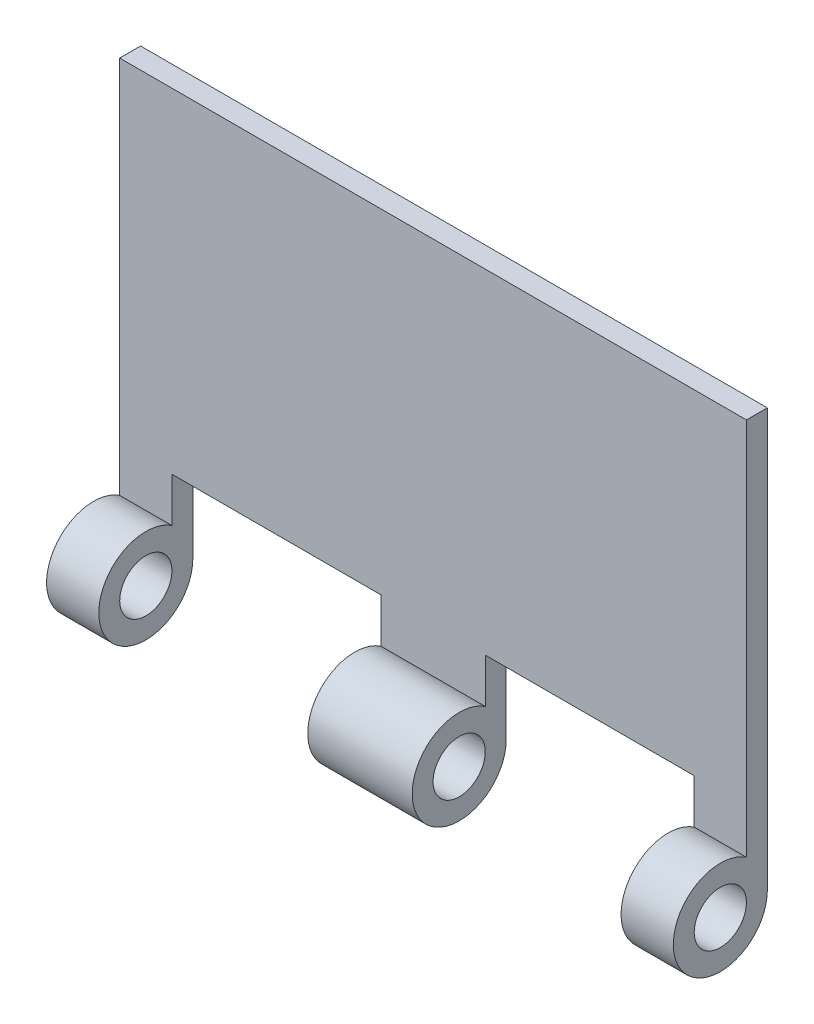
ISO-10303-21;
HEADER;
FILE_DESCRIPTION(('STEP AP214'),'2;1');
FILE_NAME('part.step','',(''),(''),'','','');
FILE_SCHEMA(('AUTOMOTIVE_DESIGN { 1 0 10303 214 1 1 1 1 }'));
ENDSEC;
DATA;
#1=APPLICATION_CONTEXT('core data for automotive mechanical design processes');
#2=APPLICATION_PROTOCOL_DEFINITION('international standard','automotive_design',2000,#1);
#3=PRODUCT_CONTEXT('',#1,'mechanical');
#4=PRODUCT('Part','Part','',(#3));
#5=PRODUCT_RELATED_PRODUCT_CATEGORY('part','',(#4));
#6=PRODUCT_DEFINITION_FORMATION('','',#4);
#7=PRODUCT_DEFINITION_CONTEXT('part definition',#1,'design');
#8=PRODUCT_DEFINITION('design','',#6,#7);
#9=PRODUCT_DEFINITION_SHAPE('','',#8);
#10=(LENGTH_UNIT() NAMED_UNIT(*) SI_UNIT(.MILLI.,.METRE.));
#11=(NAMED_UNIT(*) PLANE_ANGLE_UNIT() SI_UNIT($,.RADIAN.));
#12=(NAMED_UNIT(*) SI_UNIT($,.STERADIAN.) SOLID_ANGLE_UNIT());
#13=UNCERTAINTY_MEASURE_WITH_UNIT(LENGTH_MEASURE(1.E-05),#10,'distance_accuracy_value','');
#14=(GEOMETRIC_REPRESENTATION_CONTEXT(3) GLOBAL_UNCERTAINTY_ASSIGNED_CONTEXT((#13)) GLOBAL_UNIT_ASSIGNED_CONTEXT((#10,
#11,#12)) REPRESENTATION_CONTEXT('',''));
#15=CARTESIAN_POINT('',(0.,0.,0.));
#16=DIRECTION('',(0.,0.,1.));
#17=DIRECTION('',(1.,0.,0.));
#18=AXIS2_PLACEMENT_3D('',#15,#16,#17);
#19=CARTESIAN_POINT('',(16.1644610179245,0.,5.715));
#20=DIRECTION('',(-1.,0.,0.));
#21=DIRECTION('',(0.,0.,1.));
#22=AXIS2_PLACEMENT_3D('',#19,#20,#21);
#23=CYLINDRICAL_SURFACE('',#22,5.715);
#24=CARTESIAN_POINT('',(-6.35,0.,5.715));
#25=DIRECTION('',(1.,0.,0.));
#26=DIRECTION('',(0.,1.,0.));
#27=AXIS2_PLACEMENT_3D('',#24,#25,#26);
#28=CIRCLE('',#27,5.715);
#29=CARTESIAN_POINT('',(-6.35,0.,0.));
#30=VERTEX_POINT('',#29);
#31=CARTESIAN_POINT('',(-6.35,4.7519048812029,2.54));
#32=VERTEX_POINT('',#31);
#33=EDGE_CURVE('E200',#30,#32,#28,.F.);
#34=ORIENTED_EDGE('',*,*,#33,.F.);
#35=DIRECTION('',(1.,0.,0.));
#36=VECTOR('',#35,1.);
#37=CARTESIAN_POINT('',(0.,0.,0.));
#38=LINE('',#37,#36);
#39=CARTESIAN_POINT('',(0.,0.,0.));
#40=VERTEX_POINT('',#39);
#41=EDGE_CURVE('E254',#30,#40,#38,.T.);
#42=ORIENTED_EDGE('',*,*,#41,.T.);
#43=CARTESIAN_POINT('',(0.,0.,5.715));
#44=DIRECTION('',(-1.,0.,0.));
#45=DIRECTION('',(0.,0.,1.));
#46=AXIS2_PLACEMENT_3D('',#43,#44,#45);
#47=CIRCLE('',#46,5.715);
#48=CARTESIAN_POINT('',(0.,4.7519048812029,2.54));
#49=VERTEX_POINT('',#48);
#50=EDGE_CURVE('E212',#49,#40,#47,.F.);
#51=ORIENTED_EDGE('',*,*,#50,.F.);
#52=DIRECTION('',(-1.,0.,0.));
#53=VECTOR('',#52,1.);
#54=CARTESIAN_POINT('',(16.1644610179245,4.7519048812029,2.54));
#55=LINE('',#54,#53);
#56=EDGE_CURVE('E228',#49,#32,#55,.T.);
#57=ORIENTED_EDGE('',*,*,#56,.T.);
#58=EDGE_LOOP('',(#34,#42,#51,#57));
#59=FACE_BOUND('',#58,.T.);
#60=ADVANCED_FACE('F39',(#59),#23,.T.);
#61=CARTESIAN_POINT('',(-44.45,0.,0.));
#62=VERTEX_POINT('',#61);
#63=CARTESIAN_POINT('',(-31.75,0.,0.));
#64=VERTEX_POINT('',#63);
#65=EDGE_CURVE('E258',#62,#64,#38,.T.);
#66=ORIENTED_EDGE('',*,*,#65,.T.);
#67=CARTESIAN_POINT('',(-31.75,0.,5.715));
#68=DIRECTION('',(-1.,0.,0.));
#69=DIRECTION('',(0.,0.,1.));
#70=AXIS2_PLACEMENT_3D('',#67,#68,#69);
#71=CIRCLE('',#70,5.715);
#72=CARTESIAN_POINT('',(-31.75,4.7519048812029,2.54));
#73=VERTEX_POINT('',#72);
#74=EDGE_CURVE('E148',#73,#64,#71,.F.);
#75=ORIENTED_EDGE('',*,*,#74,.F.);
#76=CARTESIAN_POINT('',(-44.45,4.7519048812029,2.54));
#77=VERTEX_POINT('',#76);
#78=EDGE_CURVE('E233',#73,#77,#55,.T.);
#79=ORIENTED_EDGE('',*,*,#78,.T.);
#80=CARTESIAN_POINT('',(-44.45,0.,5.715));
#81=DIRECTION('',(1.,0.,0.));
#82=DIRECTION('',(0.,0.,-1.));
#83=AXIS2_PLACEMENT_3D('',#80,#81,#82);
#84=CIRCLE('',#83,5.715);
#85=EDGE_CURVE('E189',#62,#77,#84,.F.);
#86=ORIENTED_EDGE('',*,*,#85,.F.);
#87=EDGE_LOOP('',(#66,#75,#79,#86));
#88=FACE_BOUND('',#87,.T.);
#89=ADVANCED_FACE('F284',(#88),#23,.T.);
#90=CARTESIAN_POINT('',(16.1644610179245,0.,5.715));
#91=DIRECTION('',(-1.,0.,0.));
#92=DIRECTION('',(0.,0.,1.));
#93=AXIS2_PLACEMENT_3D('',#90,#91,#92);
#94=CYLINDRICAL_SURFACE('',#93,3.175);
#95=CARTESIAN_POINT('',(-6.35,0.,5.715));
#96=DIRECTION('',(1.,0.,0.));
#97=DIRECTION('',(0.,1.,0.));
#98=AXIS2_PLACEMENT_3D('',#95,#96,#97);
#99=CIRCLE('',#98,3.175);
#100=CARTESIAN_POINT('',(-6.35,0.,8.89));
#101=VERTEX_POINT('',#100);
#102=EDGE_CURVE('E43',#101,#101,#99,.F.);
#103=CARTESIAN_POINT('',(0.,0.,5.715));
#104=DIRECTION('',(-1.,0.,0.));
#105=DIRECTION('',(0.,0.,1.));
#106=AXIS2_PLACEMENT_3D('',#103,#104,#105);
#107=CIRCLE('',#106,3.175);
#108=CARTESIAN_POINT('',(0.,0.,8.89));
#109=VERTEX_POINT('',#108);
#110=EDGE_CURVE('E217',#109,#109,#107,.F.);
#111=CARTESIAN_POINT('',(-6.35,0.,8.89));
#112=CARTESIAN_POINT('',(-6.28385416666667,0.,8.89));
#113=CARTESIAN_POINT('',(-6.21770833333334,0.,8.89));
#114=CARTESIAN_POINT('',(-6.08541666666667,0.,8.89));
#115=CARTESIAN_POINT('',(-6.01927083333334,0.,8.89));
#116=CARTESIAN_POINT('',(-5.88697916666667,0.,8.89));
#117=CARTESIAN_POINT('',(-5.82083333333334,0.,8.89));
#118=CARTESIAN_POINT('',(-5.68854166666667,0.,8.89));
#119=CARTESIAN_POINT('',(-5.62239583333334,0.,8.89));
#120=CARTESIAN_POINT('',(-5.49010416666667,0.,8.89));
#121=CARTESIAN_POINT('',(-5.42395833333334,0.,8.89));
#122=CARTESIAN_POINT('',(-5.29166666666667,0.,8.89));
#123=CARTESIAN_POINT('',(-5.22552083333334,0.,8.89));
#124=CARTESIAN_POINT('',(-5.09322916666667,0.,8.89));
#125=CARTESIAN_POINT('',(-5.02708333333334,0.,8.89));
#126=CARTESIAN_POINT('',(-4.89479166666667,0.,8.89));
#127=CARTESIAN_POINT('',(-4.82864583333334,0.,8.89));
#128=CARTESIAN_POINT('',(-4.69635416666667,0.,8.89));
#129=CARTESIAN_POINT('',(-4.63020833333334,0.,8.89));
#130=CARTESIAN_POINT('',(-4.49791666666667,0.,8.89));
#131=CARTESIAN_POINT('',(-4.43177083333333,0.,8.89));
#132=CARTESIAN_POINT('',(-4.29947916666667,0.,8.89));
#133=CARTESIAN_POINT('',(-4.23333333333334,0.,8.89));
#134=CARTESIAN_POINT('',(-4.10104166666667,0.,8.89));
#135=CARTESIAN_POINT('',(-4.03489583333334,0.,8.89));
#136=CARTESIAN_POINT('',(-3.90260416666667,0.,8.89));
#137=CARTESIAN_POINT('',(-3.83645833333334,0.,8.89));
#138=CARTESIAN_POINT('',(-3.70416666666667,0.,8.89));
#139=CARTESIAN_POINT('',(-3.63802083333334,0.,8.89));
#140=CARTESIAN_POINT('',(-3.50572916666667,0.,8.89));
#141=CARTESIAN_POINT('',(-3.43958333333333,0.,8.89));
#142=CARTESIAN_POINT('',(-3.30729166666667,0.,8.89));
#143=CARTESIAN_POINT('',(-3.24114583333333,0.,8.89));
#144=CARTESIAN_POINT('',(-3.10885416666667,0.,8.89));
#145=CARTESIAN_POINT('',(-3.04270833333333,0.,8.89));
#146=CARTESIAN_POINT('',(-2.91041666666667,0.,8.89));
#147=CARTESIAN_POINT('',(-2.84427083333333,0.,8.89));
#148=CARTESIAN_POINT('',(-2.71197916666667,0.,8.89));
#149=CARTESIAN_POINT('',(-2.64583333333333,0.,8.89));
#150=CARTESIAN_POINT('',(-2.51354166666667,0.,8.89));
#151=CARTESIAN_POINT('',(-2.44739583333333,0.,8.89));
#152=CARTESIAN_POINT('',(-2.31510416666667,0.,8.89));
#153=CARTESIAN_POINT('',(-2.24895833333333,0.,8.89));
#154=CARTESIAN_POINT('',(-2.11666666666667,0.,8.89));
#155=CARTESIAN_POINT('',(-2.05052083333333,0.,8.89));
#156=CARTESIAN_POINT('',(-1.91822916666667,0.,8.89));
#157=CARTESIAN_POINT('',(-1.85208333333333,0.,8.89));
#158=CARTESIAN_POINT('',(-1.71979166666666,0.,8.89));
#159=CARTESIAN_POINT('',(-1.65364583333333,0.,8.89));
#160=CARTESIAN_POINT('',(-1.52135416666667,0.,8.89));
#161=CARTESIAN_POINT('',(-1.45520833333333,0.,8.89));
#162=CARTESIAN_POINT('',(-1.32291666666667,0.,8.89));
#163=CARTESIAN_POINT('',(-1.25677083333333,0.,8.89));
#164=CARTESIAN_POINT('',(-1.12447916666666,0.,8.89));
#165=CARTESIAN_POINT('',(-1.05833333333333,0.,8.89));
#166=CARTESIAN_POINT('',(-0.926041666666665,0.,8.89));
#167=CARTESIAN_POINT('',(-0.859895833333332,0.,8.89));
#168=CARTESIAN_POINT('',(-0.727604166666665,0.,8.89));
#169=CARTESIAN_POINT('',(-0.661458333333331,0.,8.89));
#170=CARTESIAN_POINT('',(-0.529166666666664,0.,8.89));
#171=CARTESIAN_POINT('',(-0.463020833333331,0.,8.89));
#172=CARTESIAN_POINT('',(-0.330729166666665,0.,8.89));
#173=CARTESIAN_POINT('',(-0.264583333333332,0.,8.89));
#174=CARTESIAN_POINT('',(-0.132291666666665,0.,8.89));
#175=CARTESIAN_POINT('',(-0.0661458333333306,0.,8.89));
#176=CARTESIAN_POINT('',(0.,0.,8.89));
#177=B_SPLINE_CURVE_WITH_KNOTS('',3,(#111,#112,#113,#114,#115,#116,#117,#118,#119,#120,#121,
#122,#123,#124,#125,#126,#127,#128,#129,#130,#131,#132,#133,#134,#135,#136,#137,#138,#139,#140,
#141,#142,#143,#144,#145,#146,#147,#148,#149,#150,#151,#152,#153,#154,#155,#156,#157,#158,#159,
#160,#161,#162,#163,#164,#165,#166,#167,#168,#169,#170,#171,#172,#173,#174,#175,#176),
.UNSPECIFIED.,.F.,.F.,(4,2,2,2,2,2,2,2,2,2,2,2,2,2,2,2,2,2,2,2,2,2,2,2,2,2,2,2,2,2,2,2,4),(0.,
0.198437499999999,0.396875000000001,0.5953125,0.793750000000003,0.992187500000002,1.190625,
1.3890625,1.5875,1.7859375,1.984375,2.1828125,2.38125,2.5796875,2.778125,2.97656250000001,3.175,
3.3734375,3.57187500000001,3.7703125,3.96875000000001,4.16718750000001,4.365625,
4.56406250000001,4.76250000000001,4.96093750000001,5.15937500000001,5.35781250000001,
5.55625000000001,5.75468750000001,5.95312500000001,6.15156250000001,6.35000000000001),.UNSPECIFIED.);
#178=EDGE_CURVE('BSEAM291',#101,#109,#177,.T.);
#179=ORIENTED_EDGE('',*,*,#102,.T.);
#180=ORIENTED_EDGE('',*,*,#110,.T.);
#181=ORIENTED_EDGE('',*,*,#178,.T.);
#182=ORIENTED_EDGE('',*,*,#178,.F.);
#183=EDGE_LOOP('',(#179,#181,#180,#182));
#184=FACE_BOUND('',#183,.T.);
#185=ADVANCED_FACE('F291',(#184),#94,.F.);
#186=CARTESIAN_POINT('',(0.,0.,2.54));
#187=DIRECTION('',(-1.,0.,0.));
#188=DIRECTION('',(0.,0.,1.));
#189=AXIS2_PLACEMENT_3D('',#186,#187,#188);
#190=PLANE('',#189);
#191=DIRECTION('',(0.,1.,0.));
#192=VECTOR('',#191,1.);
#193=CARTESIAN_POINT('',(0.,0.,2.54));
#194=LINE('',#193,#192);
#195=CARTESIAN_POINT('',(0.,50.8,2.54));
#196=VERTEX_POINT('',#195);
#197=EDGE_CURVE('E234',#49,#196,#194,.T.);
#198=ORIENTED_EDGE('',*,*,#197,.F.);
#199=ORIENTED_EDGE('',*,*,#50,.T.);
#200=DIRECTION('',(0.,1.,0.));
#201=VECTOR('',#200,1.);
#202=CARTESIAN_POINT('',(0.,0.,0.));
#203=LINE('',#202,#201);
#204=CARTESIAN_POINT('',(0.,50.8,0.));
#205=VERTEX_POINT('',#204);
#206=EDGE_CURVE('E232',#40,#205,#203,.T.);
#207=ORIENTED_EDGE('',*,*,#206,.T.);
#208=DIRECTION('',(0.,0.,-1.));
#209=VECTOR('',#208,1.);
#210=CARTESIAN_POINT('',(0.,50.8,2.54));
#211=LINE('',#210,#209);
#212=EDGE_CURVE('E11',#196,#205,#211,.T.);
#213=ORIENTED_EDGE('',*,*,#212,.F.);
#214=EDGE_LOOP('',(#198,#199,#207,#213));
#215=FACE_BOUND('',#214,.T.);
#216=ORIENTED_EDGE('',*,*,#110,.F.);
#217=EDGE_LOOP('',(#216));
#218=FACE_BOUND('',#217,.T.);
#219=ADVANCED_FACE('F41',(#215,#218),#190,.F.);
#220=CARTESIAN_POINT('',(0.,50.8,2.54));
#221=DIRECTION('',(0.,-1.,0.));
#222=DIRECTION('',(1.,0.,0.));
#223=AXIS2_PLACEMENT_3D('',#220,#221,#222);
#224=PLANE('',#223);
#225=DIRECTION('',(-1.,0.,0.));
#226=VECTOR('',#225,1.);
#227=CARTESIAN_POINT('',(0.,50.8,0.));
#228=LINE('',#227,#226);
#229=CARTESIAN_POINT('',(-76.2,50.8,0.));
#230=VERTEX_POINT('',#229);
#231=EDGE_CURVE('E248',#205,#230,#228,.T.);
#232=ORIENTED_EDGE('',*,*,#231,.T.);
#233=DIRECTION('',(0.,0.,-1.));
#234=VECTOR('',#233,1.);
#235=CARTESIAN_POINT('',(-76.2,50.8,2.54));
#236=LINE('',#235,#234);
#237=CARTESIAN_POINT('',(-76.2,50.8,2.54));
#238=VERTEX_POINT('',#237);
#239=EDGE_CURVE('E49',#238,#230,#236,.T.);
#240=ORIENTED_EDGE('',*,*,#239,.F.);
#241=DIRECTION('',(-1.,0.,0.));
#242=VECTOR('',#241,1.);
#243=CARTESIAN_POINT('',(0.,50.8,2.54));
#244=LINE('',#243,#242);
#245=EDGE_CURVE('E237',#196,#238,#244,.T.);
#246=ORIENTED_EDGE('',*,*,#245,.F.);
#247=ORIENTED_EDGE('',*,*,#212,.T.);
#248=EDGE_LOOP('',(#232,#240,#246,#247));
#249=FACE_BOUND('',#248,.T.);
#250=ADVANCED_FACE('F340',(#249),#224,.F.);
#251=CARTESIAN_POINT('',(-76.2,0.,2.54));
#252=DIRECTION('',(1.,0.,0.));
#253=DIRECTION('',(0.,0.,-1.));
#254=AXIS2_PLACEMENT_3D('',#251,#252,#253);
#255=PLANE('',#254);
#256=DIRECTION('',(0.,-1.,0.));
#257=VECTOR('',#256,1.);
#258=CARTESIAN_POINT('',(-76.2,0.,0.));
#259=LINE('',#258,#257);
#260=CARTESIAN_POINT('',(-76.2,0.,0.));
#261=VERTEX_POINT('',#260);
#262=EDGE_CURVE('E251',#230,#261,#259,.T.);
#263=ORIENTED_EDGE('',*,*,#262,.T.);
#264=CARTESIAN_POINT('',(-76.2,0.,5.715));
#265=DIRECTION('',(-1.,0.,0.));
#266=DIRECTION('',(0.,0.,1.));
#267=AXIS2_PLACEMENT_3D('',#264,#265,#266);
#268=CIRCLE('',#267,5.715);
#269=CARTESIAN_POINT('',(-76.2,4.7519048812029,2.54));
#270=VERTEX_POINT('',#269);
#271=EDGE_CURVE('E221',#261,#270,#268,.T.);
#272=ORIENTED_EDGE('',*,*,#271,.T.);
#273=DIRECTION('',(0.,-1.,0.));
#274=VECTOR('',#273,1.);
#275=CARTESIAN_POINT('',(-76.2,0.,2.54));
#276=LINE('',#275,#274);
#277=EDGE_CURVE('E241',#238,#270,#276,.T.);
#278=ORIENTED_EDGE('',*,*,#277,.F.);
#279=ORIENTED_EDGE('',*,*,#239,.T.);
#280=EDGE_LOOP('',(#263,#272,#278,#279));
#281=FACE_BOUND('',#280,.T.);
#282=CARTESIAN_POINT('',(-76.2,0.,5.715));
#283=DIRECTION('',(-1.,0.,0.));
#284=DIRECTION('',(0.,0.,1.));
#285=AXIS2_PLACEMENT_3D('',#282,#283,#284);
#286=CIRCLE('',#285,3.175);
#287=CARTESIAN_POINT('',(-76.2,0.,8.89));
#288=VERTEX_POINT('',#287);
#289=EDGE_CURVE('E211',#288,#288,#286,.T.);
#290=ORIENTED_EDGE('',*,*,#289,.F.);
#291=EDGE_LOOP('',(#290));
#292=FACE_BOUND('',#291,.T.);
#293=ADVANCED_FACE('F342',(#281,#292),#255,.F.);
#294=CARTESIAN_POINT('',(0.,0.,2.54));
#295=DIRECTION('',(0.,0.,1.));
#296=DIRECTION('',(1.,0.,0.));
#297=AXIS2_PLACEMENT_3D('',#294,#295,#296);
#298=PLANE('',#297);
#299=DIRECTION('',(0.,1.,0.));
#300=VECTOR('',#299,1.);
#301=CARTESIAN_POINT('',(-6.35,0.,2.54));
#302=LINE('',#301,#300);
#303=CARTESIAN_POINT('',(-6.35,10.16,2.54));
#304=VERTEX_POINT('',#303);
#305=EDGE_CURVE('E203',#32,#304,#302,.T.);
#306=ORIENTED_EDGE('',*,*,#305,.F.);
#307=ORIENTED_EDGE('',*,*,#56,.F.);
#308=ORIENTED_EDGE('',*,*,#197,.T.);
#309=ORIENTED_EDGE('',*,*,#245,.T.);
#310=ORIENTED_EDGE('',*,*,#277,.T.);
#311=CARTESIAN_POINT('',(-69.85,4.7519048812029,2.54));
#312=VERTEX_POINT('',#311);
#313=EDGE_CURVE('E216',#312,#270,#55,.T.);
#314=ORIENTED_EDGE('',*,*,#313,.F.);
#315=DIRECTION('',(0.,-1.,0.));
#316=VECTOR('',#315,1.);
#317=CARTESIAN_POINT('',(-69.85,0.,2.54));
#318=LINE('',#317,#316);
#319=CARTESIAN_POINT('',(-69.85,10.16,2.54));
#320=VERTEX_POINT('',#319);
#321=EDGE_CURVE('E57',#320,#312,#318,.T.);
#322=ORIENTED_EDGE('',*,*,#321,.F.);
#323=DIRECTION('',(-1.,0.,0.));
#324=VECTOR('',#323,1.);
#325=CARTESIAN_POINT('',(0.,10.16,2.54));
#326=LINE('',#325,#324);
#327=CARTESIAN_POINT('',(-44.45,10.16,2.54));
#328=VERTEX_POINT('',#327);
#329=EDGE_CURVE('E206',#328,#320,#326,.T.);
#330=ORIENTED_EDGE('',*,*,#329,.F.);
#331=DIRECTION('',(0.,1.,0.));
#332=VECTOR('',#331,1.);
#333=CARTESIAN_POINT('',(-44.45,0.,2.54));
#334=LINE('',#333,#332);
#335=EDGE_CURVE('E192',#77,#328,#334,.T.);
#336=ORIENTED_EDGE('',*,*,#335,.F.);
#337=ORIENTED_EDGE('',*,*,#78,.F.);
#338=DIRECTION('',(0.,-1.,0.));
#339=VECTOR('',#338,1.);
#340=CARTESIAN_POINT('',(-31.75,0.,2.54));
#341=LINE('',#340,#339);
#342=CARTESIAN_POINT('',(-31.75,10.16,2.54));
#343=VERTEX_POINT('',#342);
#344=EDGE_CURVE('E65',#343,#73,#341,.T.);
#345=ORIENTED_EDGE('',*,*,#344,.F.);
#346=DIRECTION('',(-1.,0.,0.));
#347=VECTOR('',#346,1.);
#348=CARTESIAN_POINT('',(0.,10.16,2.54));
#349=LINE('',#348,#347);
#350=EDGE_CURVE('E140',#304,#343,#349,.T.);
#351=ORIENTED_EDGE('',*,*,#350,.F.);
#352=EDGE_LOOP('',(#306,#307,#308,#309,#310,#314,#322,#330,#336,#337,#345,#351));
#353=FACE_BOUND('',#352,.T.);
#354=ADVANCED_FACE('F304',(#353),#298,.T.);
#355=CARTESIAN_POINT('',(0.,0.,0.));
#356=DIRECTION('',(0.,0.,1.));
#357=DIRECTION('',(1.,0.,0.));
#358=AXIS2_PLACEMENT_3D('',#355,#356,#357);
#359=PLANE('',#358);
#360=ORIENTED_EDGE('',*,*,#41,.F.);
#361=DIRECTION('',(0.,-1.,0.));
#362=VECTOR('',#361,1.);
#363=CARTESIAN_POINT('',(-6.35,10.16,0.));
#364=LINE('',#363,#362);
#365=CARTESIAN_POINT('',(-6.35,10.16,0.));
#366=VERTEX_POINT('',#365);
#367=EDGE_CURVE('E153',#366,#30,#364,.T.);
#368=ORIENTED_EDGE('',*,*,#367,.F.);
#369=DIRECTION('',(1.,0.,0.));
#370=VECTOR('',#369,1.);
#371=CARTESIAN_POINT('',(-6.35,10.16,0.));
#372=LINE('',#371,#370);
#373=CARTESIAN_POINT('',(-31.75,10.16,0.));
#374=VERTEX_POINT('',#373);
#375=EDGE_CURVE('E137',#374,#366,#372,.T.);
#376=ORIENTED_EDGE('',*,*,#375,.F.);
#377=DIRECTION('',(0.,1.,0.));
#378=VECTOR('',#377,1.);
#379=CARTESIAN_POINT('',(-31.75,10.16,0.));
#380=LINE('',#379,#378);
#381=EDGE_CURVE('E145',#64,#374,#380,.T.);
#382=ORIENTED_EDGE('',*,*,#381,.F.);
#383=ORIENTED_EDGE('',*,*,#65,.F.);
#384=DIRECTION('',(0.,-1.,0.));
#385=VECTOR('',#384,1.);
#386=CARTESIAN_POINT('',(-44.45,10.16,0.));
#387=LINE('',#386,#385);
#388=CARTESIAN_POINT('',(-44.45,10.16,0.));
#389=VERTEX_POINT('',#388);
#390=EDGE_CURVE('E165',#389,#62,#387,.T.);
#391=ORIENTED_EDGE('',*,*,#390,.F.);
#392=DIRECTION('',(1.,0.,0.));
#393=VECTOR('',#392,1.);
#394=CARTESIAN_POINT('',(-44.45,10.16,0.));
#395=LINE('',#394,#393);
#396=CARTESIAN_POINT('',(-69.85,10.16,0.));
#397=VERTEX_POINT('',#396);
#398=EDGE_CURVE('E173',#397,#389,#395,.T.);
#399=ORIENTED_EDGE('',*,*,#398,.F.);
#400=DIRECTION('',(0.,1.,0.));
#401=VECTOR('',#400,1.);
#402=CARTESIAN_POINT('',(-69.85,10.16,0.));
#403=LINE('',#402,#401);
#404=CARTESIAN_POINT('',(-69.85,0.,0.));
#405=VERTEX_POINT('',#404);
#406=EDGE_CURVE('E169',#405,#397,#403,.T.);
#407=ORIENTED_EDGE('',*,*,#406,.F.);
#408=EDGE_CURVE('E238',#261,#405,#38,.T.);
#409=ORIENTED_EDGE('',*,*,#408,.F.);
#410=ORIENTED_EDGE('',*,*,#262,.F.);
#411=ORIENTED_EDGE('',*,*,#231,.F.);
#412=ORIENTED_EDGE('',*,*,#206,.F.);
#413=EDGE_LOOP('',(#360,#368,#376,#382,#383,#391,#399,#407,#409,#410,#411,#412));
#414=FACE_BOUND('',#413,.T.);
#415=ADVANCED_FACE('F156',(#414),#359,.F.);
#416=ORIENTED_EDGE('',*,*,#408,.T.);
#417=CARTESIAN_POINT('',(-69.85,0.,5.715));
#418=DIRECTION('',(-1.,0.,0.));
#419=DIRECTION('',(0.,0.,1.));
#420=AXIS2_PLACEMENT_3D('',#417,#418,#419);
#421=CIRCLE('',#420,5.715);
#422=EDGE_CURVE('E183',#312,#405,#421,.F.);
#423=ORIENTED_EDGE('',*,*,#422,.F.);
#424=ORIENTED_EDGE('',*,*,#313,.T.);
#425=ORIENTED_EDGE('',*,*,#271,.F.);
#426=EDGE_LOOP('',(#416,#423,#424,#425));
#427=FACE_BOUND('',#426,.T.);
#428=ADVANCED_FACE('F287',(#427),#23,.T.);
#429=CARTESIAN_POINT('',(-69.85,0.,5.715));
#430=DIRECTION('',(-1.,0.,0.));
#431=DIRECTION('',(0.,0.,1.));
#432=AXIS2_PLACEMENT_3D('',#429,#430,#431);
#433=CIRCLE('',#432,3.175);
#434=CARTESIAN_POINT('',(-69.85,0.,8.89));
#435=VERTEX_POINT('',#434);
#436=EDGE_CURVE('E163',#435,#435,#433,.F.);
#437=CARTESIAN_POINT('',(-69.85,0.,8.89));
#438=CARTESIAN_POINT('',(-69.9161458333334,0.,8.89));
#439=CARTESIAN_POINT('',(-69.9822916666667,0.,8.89));
#440=CARTESIAN_POINT('',(-70.1145833333334,0.,8.89));
#441=CARTESIAN_POINT('',(-70.1807291666667,0.,8.89));
#442=CARTESIAN_POINT('',(-70.3130208333334,0.,8.89));
#443=CARTESIAN_POINT('',(-70.3791666666667,0.,8.89));
#444=CARTESIAN_POINT('',(-70.5114583333334,0.,8.89));
#445=CARTESIAN_POINT('',(-70.5776041666667,0.,8.89));
#446=CARTESIAN_POINT('',(-70.7098958333333,0.,8.89));
#447=CARTESIAN_POINT('',(-70.7760416666667,0.,8.89));
#448=CARTESIAN_POINT('',(-70.9083333333333,0.,8.89));
#449=CARTESIAN_POINT('',(-70.9744791666667,0.,8.89));
#450=CARTESIAN_POINT('',(-71.1067708333334,0.,8.89));
#451=CARTESIAN_POINT('',(-71.1729166666667,0.,8.89));
#452=CARTESIAN_POINT('',(-71.3052083333334,0.,8.89));
#453=CARTESIAN_POINT('',(-71.3713541666667,0.,8.89));
#454=CARTESIAN_POINT('',(-71.5036458333334,0.,8.89));
#455=CARTESIAN_POINT('',(-71.5697916666667,0.,8.89));
#456=CARTESIAN_POINT('',(-71.7020833333333,0.,8.89));
#457=CARTESIAN_POINT('',(-71.7682291666667,0.,8.89));
#458=CARTESIAN_POINT('',(-71.9005208333333,0.,8.89));
#459=CARTESIAN_POINT('',(-71.9666666666667,0.,8.89));
#460=CARTESIAN_POINT('',(-72.0989583333334,0.,8.89));
#461=CARTESIAN_POINT('',(-72.1651041666667,0.,8.89));
#462=CARTESIAN_POINT('',(-72.2973958333334,0.,8.89));
#463=CARTESIAN_POINT('',(-72.3635416666667,0.,8.89));
#464=CARTESIAN_POINT('',(-72.4958333333333,0.,8.89));
#465=CARTESIAN_POINT('',(-72.5619791666667,0.,8.89));
#466=CARTESIAN_POINT('',(-72.6942708333333,0.,8.89));
#467=CARTESIAN_POINT('',(-72.7604166666667,0.,8.89));
#468=CARTESIAN_POINT('',(-72.8927083333333,0.,8.89));
#469=CARTESIAN_POINT('',(-72.9588541666667,0.,8.89));
#470=CARTESIAN_POINT('',(-73.0911458333333,0.,8.89));
#471=CARTESIAN_POINT('',(-73.1572916666667,0.,8.89));
#472=CARTESIAN_POINT('',(-73.2895833333333,0.,8.89));
#473=CARTESIAN_POINT('',(-73.3557291666667,0.,8.89));
#474=CARTESIAN_POINT('',(-73.4880208333333,0.,8.89));
#475=CARTESIAN_POINT('',(-73.5541666666667,0.,8.89));
#476=CARTESIAN_POINT('',(-73.6864583333333,0.,8.89));
#477=CARTESIAN_POINT('',(-73.7526041666667,0.,8.89));
#478=CARTESIAN_POINT('',(-73.8848958333333,0.,8.89));
#479=CARTESIAN_POINT('',(-73.9510416666667,0.,8.89));
#480=CARTESIAN_POINT('',(-74.0833333333333,0.,8.89));
#481=CARTESIAN_POINT('',(-74.1494791666667,0.,8.89));
#482=CARTESIAN_POINT('',(-74.2817708333333,0.,8.89));
#483=CARTESIAN_POINT('',(-74.3479166666667,0.,8.89));
#484=CARTESIAN_POINT('',(-74.4802083333333,0.,8.89));
#485=CARTESIAN_POINT('',(-74.5463541666667,0.,8.89));
#486=CARTESIAN_POINT('',(-74.6786458333333,0.,8.89));
#487=CARTESIAN_POINT('',(-74.7447916666667,0.,8.89));
#488=CARTESIAN_POINT('',(-74.8770833333333,0.,8.89));
#489=CARTESIAN_POINT('',(-74.9432291666667,0.,8.89));
#490=CARTESIAN_POINT('',(-75.0755208333333,0.,8.89));
#491=CARTESIAN_POINT('',(-75.1416666666667,0.,8.89));
#492=CARTESIAN_POINT('',(-75.2739583333333,0.,8.89));
#493=CARTESIAN_POINT('',(-75.3401041666667,0.,8.89));
#494=CARTESIAN_POINT('',(-75.4723958333333,0.,8.89));
#495=CARTESIAN_POINT('',(-75.5385416666667,0.,8.89));
#496=CARTESIAN_POINT('',(-75.6708333333333,0.,8.89));
#497=CARTESIAN_POINT('',(-75.7369791666667,0.,8.89));
#498=CARTESIAN_POINT('',(-75.8692708333333,0.,8.89));
#499=CARTESIAN_POINT('',(-75.9354166666667,0.,8.89));
#500=CARTESIAN_POINT('',(-76.0677083333333,0.,8.89));
#501=CARTESIAN_POINT('',(-76.1338541666667,0.,8.89));
#502=CARTESIAN_POINT('',(-76.2,0.,8.89));
#503=B_SPLINE_CURVE_WITH_KNOTS('',3,(#437,#438,#439,#440,#441,#442,#443,#444,#445,#446,#447,
#448,#449,#450,#451,#452,#453,#454,#455,#456,#457,#458,#459,#460,#461,#462,#463,#464,#465,#466,
#467,#468,#469,#470,#471,#472,#473,#474,#475,#476,#477,#478,#479,#480,#481,#482,#483,#484,#485,
#486,#487,#488,#489,#490,#491,#492,#493,#494,#495,#496,#497,#498,#499,#500,#501,#502),
.UNSPECIFIED.,.F.,.F.,(4,2,2,2,2,2,2,2,2,2,2,2,2,2,2,2,2,2,2,2,2,2,2,2,2,2,2,2,2,2,2,2,4),(0.,
0.198437499999995,0.396874999999991,0.5953125,0.793749999999996,0.992187499999991,1.190625,
1.3890625,1.58749999999999,1.78593749999999,1.98437499999998,2.18281249999999,2.38124999999999,
2.57968749999998,2.77812499999999,2.97656249999999,3.17499999999998,3.37343749999998,
3.57187499999997,3.77031249999998,3.96874999999998,4.16718749999997,4.36562499999998,
4.56406249999998,4.76249999999998,4.96093749999997,5.15937499999997,5.35781249999998,
5.55624999999997,5.75468749999997,5.95312499999998,6.15156249999997,6.34999999999997),.UNSPECIFIED.);
#504=EDGE_CURVE('BSEAM296',#435,#288,#503,.T.);
#505=ORIENTED_EDGE('',*,*,#436,.T.);
#506=ORIENTED_EDGE('',*,*,#289,.T.);
#507=ORIENTED_EDGE('',*,*,#504,.T.);
#508=ORIENTED_EDGE('',*,*,#504,.F.);
#509=EDGE_LOOP('',(#505,#507,#506,#508));
#510=FACE_BOUND('',#509,.T.);
#511=ADVANCED_FACE('F296',(#510),#94,.F.);
#512=CARTESIAN_POINT('',(-44.45,10.16,11.43));
#513=DIRECTION('',(1.,0.,0.));
#514=DIRECTION('',(0.,0.,-1.));
#515=AXIS2_PLACEMENT_3D('',#512,#513,#514);
#516=PLANE('',#515);
#517=ORIENTED_EDGE('',*,*,#335,.T.);
#518=DIRECTION('',(0.,0.,-1.));
#519=VECTOR('',#518,1.);
#520=CARTESIAN_POINT('',(-44.45,10.16,11.43));
#521=LINE('',#520,#519);
#522=EDGE_CURVE('E178',#328,#389,#521,.T.);
#523=ORIENTED_EDGE('',*,*,#522,.T.);
#524=ORIENTED_EDGE('',*,*,#390,.T.);
#525=ORIENTED_EDGE('',*,*,#85,.T.);
#526=EDGE_LOOP('',(#517,#523,#524,#525));
#527=FACE_BOUND('',#526,.T.);
#528=CARTESIAN_POINT('',(-44.45,0.,5.715));
#529=DIRECTION('',(1.,0.,0.));
#530=DIRECTION('',(0.,0.,-1.));
#531=AXIS2_PLACEMENT_3D('',#528,#529,#530);
#532=CIRCLE('',#531,3.175);
#533=CARTESIAN_POINT('',(-44.45,0.,8.89));
#534=VERTEX_POINT('',#533);
#535=EDGE_CURVE('E188',#534,#534,#532,.F.);
#536=ORIENTED_EDGE('',*,*,#535,.F.);
#537=EDGE_LOOP('',(#536));
#538=FACE_BOUND('',#537,.T.);
#539=ADVANCED_FACE('F302',(#527,#538),#516,.F.);
#540=CARTESIAN_POINT('',(-69.85,10.16,11.43));
#541=DIRECTION('',(-1.,0.,0.));
#542=DIRECTION('',(0.,0.,1.));
#543=AXIS2_PLACEMENT_3D('',#540,#541,#542);
#544=PLANE('',#543);
#545=ORIENTED_EDGE('',*,*,#321,.T.);
#546=ORIENTED_EDGE('',*,*,#422,.T.);
#547=ORIENTED_EDGE('',*,*,#406,.T.);
#548=DIRECTION('',(0.,0.,-1.));
#549=VECTOR('',#548,1.);
#550=CARTESIAN_POINT('',(-69.85,10.16,11.43));
#551=LINE('',#550,#549);
#552=EDGE_CURVE('E177',#320,#397,#551,.T.);
#553=ORIENTED_EDGE('',*,*,#552,.F.);
#554=EDGE_LOOP('',(#545,#546,#547,#553));
#555=FACE_BOUND('',#554,.T.);
#556=ORIENTED_EDGE('',*,*,#436,.F.);
#557=EDGE_LOOP('',(#556));
#558=FACE_BOUND('',#557,.T.);
#559=ADVANCED_FACE('F313',(#555,#558),#544,.F.);
#560=CARTESIAN_POINT('',(-44.45,10.16,11.43));
#561=DIRECTION('',(0.,1.,0.));
#562=DIRECTION('',(0.,0.,1.));
#563=AXIS2_PLACEMENT_3D('',#560,#561,#562);
#564=PLANE('',#563);
#565=ORIENTED_EDGE('',*,*,#329,.T.);
#566=ORIENTED_EDGE('',*,*,#552,.T.);
#567=ORIENTED_EDGE('',*,*,#398,.T.);
#568=ORIENTED_EDGE('',*,*,#522,.F.);
#569=EDGE_LOOP('',(#565,#566,#567,#568));
#570=FACE_BOUND('',#569,.T.);
#571=ADVANCED_FACE('F328',(#570),#564,.F.);
#572=CARTESIAN_POINT('',(-31.75,0.,5.715));
#573=DIRECTION('',(-1.,0.,0.));
#574=DIRECTION('',(0.,0.,1.));
#575=AXIS2_PLACEMENT_3D('',#572,#573,#574);
#576=CIRCLE('',#575,3.175);
#577=CARTESIAN_POINT('',(-31.75,0.,8.89));
#578=VERTEX_POINT('',#577);
#579=EDGE_CURVE('E195',#578,#578,#576,.F.);
#580=CARTESIAN_POINT('',(-31.75,0.,8.89));
#581=CARTESIAN_POINT('',(-31.8822916666667,0.,8.89));
#582=CARTESIAN_POINT('',(-32.0145833333333,0.,8.89));
#583=CARTESIAN_POINT('',(-32.2791666666667,0.,8.89));
#584=CARTESIAN_POINT('',(-32.4114583333333,0.,8.89));
#585=CARTESIAN_POINT('',(-32.6760416666667,0.,8.89));
#586=CARTESIAN_POINT('',(-32.8083333333333,0.,8.89));
#587=CARTESIAN_POINT('',(-33.0729166666667,0.,8.89));
#588=CARTESIAN_POINT('',(-33.2052083333333,0.,8.89));
#589=CARTESIAN_POINT('',(-33.4697916666667,0.,8.89));
#590=CARTESIAN_POINT('',(-33.6020833333333,0.,8.89));
#591=CARTESIAN_POINT('',(-33.8666666666667,0.,8.89));
#592=CARTESIAN_POINT('',(-33.9989583333333,0.,8.89));
#593=CARTESIAN_POINT('',(-34.2635416666667,0.,8.89));
#594=CARTESIAN_POINT('',(-34.3958333333333,0.,8.89));
#595=CARTESIAN_POINT('',(-34.6604166666667,0.,8.89));
#596=CARTESIAN_POINT('',(-34.7927083333333,0.,8.89));
#597=CARTESIAN_POINT('',(-35.0572916666667,0.,8.89));
#598=CARTESIAN_POINT('',(-35.1895833333333,0.,8.89));
#599=CARTESIAN_POINT('',(-35.4541666666667,0.,8.89));
#600=CARTESIAN_POINT('',(-35.5864583333333,0.,8.89));
#601=CARTESIAN_POINT('',(-35.8510416666667,0.,8.89));
#602=CARTESIAN_POINT('',(-35.9833333333333,0.,8.89));
#603=CARTESIAN_POINT('',(-36.2479166666667,0.,8.89));
#604=CARTESIAN_POINT('',(-36.3802083333333,0.,8.89));
#605=CARTESIAN_POINT('',(-36.6447916666667,0.,8.89));
#606=CARTESIAN_POINT('',(-36.7770833333333,0.,8.89));
#607=CARTESIAN_POINT('',(-37.0416666666667,0.,8.89));
#608=CARTESIAN_POINT('',(-37.1739583333333,0.,8.89));
#609=CARTESIAN_POINT('',(-37.4385416666667,0.,8.89));
#610=CARTESIAN_POINT('',(-37.5708333333333,0.,8.89));
#611=CARTESIAN_POINT('',(-37.8354166666667,0.,8.89));
#612=CARTESIAN_POINT('',(-37.9677083333333,0.,8.89));
#613=CARTESIAN_POINT('',(-38.2322916666667,0.,8.89));
#614=CARTESIAN_POINT('',(-38.3645833333333,0.,8.89));
#615=CARTESIAN_POINT('',(-38.6291666666667,0.,8.89));
#616=CARTESIAN_POINT('',(-38.7614583333333,0.,8.89));
#617=CARTESIAN_POINT('',(-39.0260416666667,0.,8.89));
#618=CARTESIAN_POINT('',(-39.1583333333333,0.,8.89));
#619=CARTESIAN_POINT('',(-39.4229166666667,0.,8.89));
#620=CARTESIAN_POINT('',(-39.5552083333333,0.,8.89));
#621=CARTESIAN_POINT('',(-39.8197916666667,0.,8.89));
#622=CARTESIAN_POINT('',(-39.9520833333333,0.,8.89));
#623=CARTESIAN_POINT('',(-40.2166666666667,0.,8.89));
#624=CARTESIAN_POINT('',(-40.3489583333333,0.,8.89));
#625=CARTESIAN_POINT('',(-40.6135416666667,0.,8.89));
#626=CARTESIAN_POINT('',(-40.7458333333333,0.,8.89));
#627=CARTESIAN_POINT('',(-41.0104166666667,0.,8.89));
#628=CARTESIAN_POINT('',(-41.1427083333333,0.,8.89));
#629=CARTESIAN_POINT('',(-41.4072916666667,0.,8.89));
#630=CARTESIAN_POINT('',(-41.5395833333333,0.,8.89));
#631=CARTESIAN_POINT('',(-41.8041666666667,0.,8.89));
#632=CARTESIAN_POINT('',(-41.9364583333333,0.,8.89));
#633=CARTESIAN_POINT('',(-42.2010416666667,0.,8.89));
#634=CARTESIAN_POINT('',(-42.3333333333333,0.,8.89));
#635=CARTESIAN_POINT('',(-42.5979166666667,0.,8.89));
#636=CARTESIAN_POINT('',(-42.7302083333333,0.,8.89));
#637=CARTESIAN_POINT('',(-42.9947916666667,0.,8.89));
#638=CARTESIAN_POINT('',(-43.1270833333333,0.,8.89));
#639=CARTESIAN_POINT('',(-43.3916666666667,0.,8.89));
#640=CARTESIAN_POINT('',(-43.5239583333333,0.,8.89));
#641=CARTESIAN_POINT('',(-43.7885416666667,0.,8.89));
#642=CARTESIAN_POINT('',(-43.9208333333333,0.,8.89));
#643=CARTESIAN_POINT('',(-44.1854166666667,0.,8.89));
#644=CARTESIAN_POINT('',(-44.3177083333333,0.,8.89));
#645=CARTESIAN_POINT('',(-44.45,0.,8.89));
#646=B_SPLINE_CURVE_WITH_KNOTS('',3,(#580,#581,#582,#583,#584,#585,#586,#587,#588,#589,#590,
#591,#592,#593,#594,#595,#596,#597,#598,#599,#600,#601,#602,#603,#604,#605,#606,#607,#608,#609,
#610,#611,#612,#613,#614,#615,#616,#617,#618,#619,#620,#621,#622,#623,#624,#625,#626,#627,#628,
#629,#630,#631,#632,#633,#634,#635,#636,#637,#638,#639,#640,#641,#642,#643,#644,#645),
.UNSPECIFIED.,.F.,.F.,(4,2,2,2,2,2,2,2,2,2,2,2,2,2,2,2,2,2,2,2,2,2,2,2,2,2,2,2,2,2,2,2,4),(0.,
0.396874999999998,0.793750000000003,1.190625,1.58750000000001,1.984375,2.38125,2.77812500000001,
3.175,3.571875,3.96875000000001,4.365625,4.7625,5.15937500000001,5.55625000000001,
5.95312500000001,6.35000000000001,6.74687500000001,7.14375000000001,7.54062500000001,
7.93750000000001,8.33437500000001,8.73125000000001,9.12812500000001,9.52500000000001,
9.92187500000001,10.31875,10.715625,11.1125,11.509375,11.90625,12.303125,12.7),.UNSPECIFIED.);
#647=EDGE_CURVE('BSEAM271',#578,#534,#646,.T.);
#648=ORIENTED_EDGE('',*,*,#579,.T.);
#649=ORIENTED_EDGE('',*,*,#535,.T.);
#650=ORIENTED_EDGE('',*,*,#647,.T.);
#651=ORIENTED_EDGE('',*,*,#647,.F.);
#652=EDGE_LOOP('',(#648,#650,#649,#651));
#653=FACE_BOUND('',#652,.T.);
#654=ADVANCED_FACE('F271',(#653),#94,.F.);
#655=CARTESIAN_POINT('',(-6.35,10.16,11.43));
#656=DIRECTION('',(1.,0.,0.));
#657=DIRECTION('',(0.,1.,0.));
#658=AXIS2_PLACEMENT_3D('',#655,#656,#657);
#659=PLANE('',#658);
#660=ORIENTED_EDGE('',*,*,#305,.T.);
#661=DIRECTION('',(0.,0.,-1.));
#662=VECTOR('',#661,1.);
#663=CARTESIAN_POINT('',(-6.35,10.16,11.43));
#664=LINE('',#663,#662);
#665=EDGE_CURVE('E142',#304,#366,#664,.T.);
#666=ORIENTED_EDGE('',*,*,#665,.T.);
#667=ORIENTED_EDGE('',*,*,#367,.T.);
#668=ORIENTED_EDGE('',*,*,#33,.T.);
#669=EDGE_LOOP('',(#660,#666,#667,#668));
#670=FACE_BOUND('',#669,.T.);
#671=ORIENTED_EDGE('',*,*,#102,.F.);
#672=EDGE_LOOP('',(#671));
#673=FACE_BOUND('',#672,.T.);
#674=ADVANCED_FACE('F274',(#670,#673),#659,.F.);
#675=CARTESIAN_POINT('',(-31.75,10.16,11.43));
#676=DIRECTION('',(-1.,0.,0.));
#677=DIRECTION('',(0.,0.,1.));
#678=AXIS2_PLACEMENT_3D('',#675,#676,#677);
#679=PLANE('',#678);
#680=ORIENTED_EDGE('',*,*,#344,.T.);
#681=ORIENTED_EDGE('',*,*,#74,.T.);
#682=ORIENTED_EDGE('',*,*,#381,.T.);
#683=DIRECTION('',(0.,0.,-1.));
#684=VECTOR('',#683,1.);
#685=CARTESIAN_POINT('',(-31.75,10.16,11.43));
#686=LINE('',#685,#684);
#687=EDGE_CURVE('E132',#343,#374,#686,.T.);
#688=ORIENTED_EDGE('',*,*,#687,.F.);
#689=EDGE_LOOP('',(#680,#681,#682,#688));
#690=FACE_BOUND('',#689,.T.);
#691=ORIENTED_EDGE('',*,*,#579,.F.);
#692=EDGE_LOOP('',(#691));
#693=FACE_BOUND('',#692,.T.);
#694=ADVANCED_FACE('F146',(#690,#693),#679,.F.);
#695=CARTESIAN_POINT('',(-6.35,10.16,11.43));
#696=DIRECTION('',(0.,1.,0.));
#697=DIRECTION('',(-1.,0.,0.));
#698=AXIS2_PLACEMENT_3D('',#695,#696,#697);
#699=PLANE('',#698);
#700=ORIENTED_EDGE('',*,*,#350,.T.);
#701=ORIENTED_EDGE('',*,*,#687,.T.);
#702=ORIENTED_EDGE('',*,*,#375,.T.);
#703=ORIENTED_EDGE('',*,*,#665,.F.);
#704=EDGE_LOOP('',(#700,#701,#702,#703));
#705=FACE_BOUND('',#704,.T.);
#706=ADVANCED_FACE('F134',(#705),#699,.F.);
#707=CLOSED_SHELL('',(#60,#89,#185,#219,#250,#293,#354,#415,#428,#511,#539,#559,#571,#654,#674,
#694,#706));
#708=MANIFOLD_SOLID_BREP('B2',#707);
#709=ADVANCED_BREP_SHAPE_REPRESENTATION('',(#18,#708),#14);
#710=SHAPE_DEFINITION_REPRESENTATION(#9,#709);
ENDSEC;
END-ISO-10303-21;
